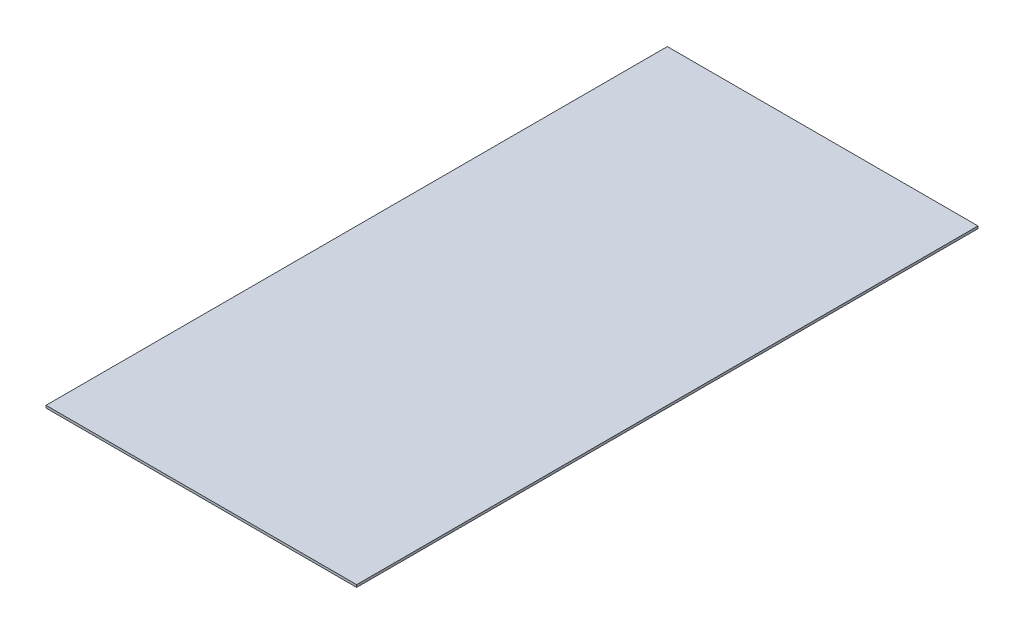
ISO-10303-21;
HEADER;
FILE_DESCRIPTION(('STEP AP214'),'2;1');
FILE_NAME('part.step','',(''),(''),'','','');
FILE_SCHEMA(('AUTOMOTIVE_DESIGN { 1 0 10303 214 1 1 1 1 }'));
ENDSEC;
DATA;
#1=APPLICATION_CONTEXT('core data for automotive mechanical design processes');
#2=APPLICATION_PROTOCOL_DEFINITION('international standard','automotive_design',2000,#1);
#3=PRODUCT_CONTEXT('',#1,'mechanical');
#4=PRODUCT('Part','Part','',(#3));
#5=PRODUCT_RELATED_PRODUCT_CATEGORY('part','',(#4));
#6=PRODUCT_DEFINITION_FORMATION('','',#4);
#7=PRODUCT_DEFINITION_CONTEXT('part definition',#1,'design');
#8=PRODUCT_DEFINITION('design','',#6,#7);
#9=PRODUCT_DEFINITION_SHAPE('','',#8);
#10=(LENGTH_UNIT() NAMED_UNIT(*) SI_UNIT(.MILLI.,.METRE.));
#11=(NAMED_UNIT(*) PLANE_ANGLE_UNIT() SI_UNIT($,.RADIAN.));
#12=(NAMED_UNIT(*) SI_UNIT($,.STERADIAN.) SOLID_ANGLE_UNIT());
#13=UNCERTAINTY_MEASURE_WITH_UNIT(LENGTH_MEASURE(1.E-05),#10,'distance_accuracy_value','');
#14=(GEOMETRIC_REPRESENTATION_CONTEXT(3) GLOBAL_UNCERTAINTY_ASSIGNED_CONTEXT((#13)) GLOBAL_UNIT_ASSIGNED_CONTEXT((#10,
#11,#12)) REPRESENTATION_CONTEXT('',''));
#15=CARTESIAN_POINT('',(0.,0.,0.));
#16=DIRECTION('',(0.,0.,1.));
#17=DIRECTION('',(1.,0.,0.));
#18=AXIS2_PLACEMENT_3D('',#15,#16,#17);
#19=CARTESIAN_POINT('',(609.6,9.5,1219.2));
#20=DIRECTION('',(-1.,0.,0.));
#21=DIRECTION('',(0.,0.,1.));
#22=AXIS2_PLACEMENT_3D('',#19,#20,#21);
#23=PLANE('',#22);
#24=DIRECTION('',(0.,0.,-1.));
#25=VECTOR('',#24,1.);
#26=CARTESIAN_POINT('',(609.6,0.,1219.2));
#27=LINE('',#26,#25);
#28=CARTESIAN_POINT('',(609.6,0.,1219.2));
#29=VERTEX_POINT('',#28);
#30=CARTESIAN_POINT('',(609.6,0.,-1219.2));
#31=VERTEX_POINT('',#30);
#32=EDGE_CURVE('E96',#29,#31,#27,.T.);
#33=ORIENTED_EDGE('',*,*,#32,.T.);
#34=DIRECTION('',(0.,-1.,0.));
#35=VECTOR('',#34,1.);
#36=CARTESIAN_POINT('',(609.6,9.5,-1219.2));
#37=LINE('',#36,#35);
#38=CARTESIAN_POINT('',(609.6,9.5,-1219.2));
#39=VERTEX_POINT('',#38);
#40=EDGE_CURVE('E11',#39,#31,#37,.T.);
#41=ORIENTED_EDGE('',*,*,#40,.F.);
#42=DIRECTION('',(0.,0.,-1.));
#43=VECTOR('',#42,1.);
#44=CARTESIAN_POINT('',(609.6,9.5,1219.2));
#45=LINE('',#44,#43);
#46=CARTESIAN_POINT('',(609.6,9.5,1219.2));
#47=VERTEX_POINT('',#46);
#48=EDGE_CURVE('E84',#47,#39,#45,.T.);
#49=ORIENTED_EDGE('',*,*,#48,.F.);
#50=DIRECTION('',(0.,-1.,0.));
#51=VECTOR('',#50,1.);
#52=CARTESIAN_POINT('',(609.6,9.5,1219.2));
#53=LINE('',#52,#51);
#54=EDGE_CURVE('E92',#47,#29,#53,.T.);
#55=ORIENTED_EDGE('',*,*,#54,.T.);
#56=EDGE_LOOP('',(#33,#41,#49,#55));
#57=FACE_BOUND('',#56,.T.);
#58=ADVANCED_FACE('F33',(#57),#23,.F.);
#59=CARTESIAN_POINT('',(-609.6,9.5,-1219.2));
#60=DIRECTION('',(0.,0.,1.));
#61=DIRECTION('',(1.,0.,0.));
#62=AXIS2_PLACEMENT_3D('',#59,#60,#61);
#63=PLANE('',#62);
#64=DIRECTION('',(-1.,0.,0.));
#65=VECTOR('',#64,1.);
#66=CARTESIAN_POINT('',(-609.6,0.,-1219.2));
#67=LINE('',#66,#65);
#68=CARTESIAN_POINT('',(-609.6,0.,-1219.2));
#69=VERTEX_POINT('',#68);
#70=EDGE_CURVE('E88',#31,#69,#67,.T.);
#71=ORIENTED_EDGE('',*,*,#70,.T.);
#72=DIRECTION('',(0.,-1.,0.));
#73=VECTOR('',#72,1.);
#74=CARTESIAN_POINT('',(-609.6,9.5,-1219.2));
#75=LINE('',#74,#73);
#76=CARTESIAN_POINT('',(-609.6,9.5,-1219.2));
#77=VERTEX_POINT('',#76);
#78=EDGE_CURVE('E41',#77,#69,#75,.T.);
#79=ORIENTED_EDGE('',*,*,#78,.F.);
#80=DIRECTION('',(-1.,0.,0.));
#81=VECTOR('',#80,1.);
#82=CARTESIAN_POINT('',(-609.6,9.5,-1219.2));
#83=LINE('',#82,#81);
#84=EDGE_CURVE('E79',#39,#77,#83,.T.);
#85=ORIENTED_EDGE('',*,*,#84,.F.);
#86=ORIENTED_EDGE('',*,*,#40,.T.);
#87=EDGE_LOOP('',(#71,#79,#85,#86));
#88=FACE_BOUND('',#87,.T.);
#89=ADVANCED_FACE('F87',(#88),#63,.F.);
#90=CARTESIAN_POINT('',(-609.6,9.5,1219.2));
#91=DIRECTION('',(1.,0.,0.));
#92=DIRECTION('',(0.,0.,-1.));
#93=AXIS2_PLACEMENT_3D('',#90,#91,#92);
#94=PLANE('',#93);
#95=DIRECTION('',(0.,0.,1.));
#96=VECTOR('',#95,1.);
#97=CARTESIAN_POINT('',(-609.6,0.,1219.2));
#98=LINE('',#97,#96);
#99=CARTESIAN_POINT('',(-609.6,0.,1219.2));
#100=VERTEX_POINT('',#99);
#101=EDGE_CURVE('E66',#69,#100,#98,.T.);
#102=ORIENTED_EDGE('',*,*,#101,.T.);
#103=DIRECTION('',(0.,-1.,0.));
#104=VECTOR('',#103,1.);
#105=CARTESIAN_POINT('',(-609.6,9.5,1219.2));
#106=LINE('',#105,#104);
#107=CARTESIAN_POINT('',(-609.6,9.5,1219.2));
#108=VERTEX_POINT('',#107);
#109=EDGE_CURVE('E89',#108,#100,#106,.T.);
#110=ORIENTED_EDGE('',*,*,#109,.F.);
#111=DIRECTION('',(0.,0.,1.));
#112=VECTOR('',#111,1.);
#113=CARTESIAN_POINT('',(-609.6,9.5,1219.2));
#114=LINE('',#113,#112);
#115=EDGE_CURVE('E82',#77,#108,#114,.T.);
#116=ORIENTED_EDGE('',*,*,#115,.F.);
#117=ORIENTED_EDGE('',*,*,#78,.T.);
#118=EDGE_LOOP('',(#102,#110,#116,#117));
#119=FACE_BOUND('',#118,.T.);
#120=ADVANCED_FACE('F90',(#119),#94,.F.);
#121=CARTESIAN_POINT('',(-609.6,9.5,1219.2));
#122=DIRECTION('',(0.,0.,-1.));
#123=DIRECTION('',(-1.,0.,0.));
#124=AXIS2_PLACEMENT_3D('',#121,#122,#123);
#125=PLANE('',#124);
#126=DIRECTION('',(1.,0.,0.));
#127=VECTOR('',#126,1.);
#128=CARTESIAN_POINT('',(-609.6,0.,1219.2));
#129=LINE('',#128,#127);
#130=EDGE_CURVE('E72',#100,#29,#129,.T.);
#131=ORIENTED_EDGE('',*,*,#130,.T.);
#132=ORIENTED_EDGE('',*,*,#54,.F.);
#133=DIRECTION('',(1.,0.,0.));
#134=VECTOR('',#133,1.);
#135=CARTESIAN_POINT('',(-609.6,9.5,1219.2));
#136=LINE('',#135,#134);
#137=EDGE_CURVE('E49',#108,#47,#136,.T.);
#138=ORIENTED_EDGE('',*,*,#137,.F.);
#139=ORIENTED_EDGE('',*,*,#109,.T.);
#140=EDGE_LOOP('',(#131,#132,#138,#139));
#141=FACE_BOUND('',#140,.T.);
#142=ADVANCED_FACE('F103',(#141),#125,.F.);
#143=CARTESIAN_POINT('',(0.,9.5,0.));
#144=DIRECTION('',(0.,-1.,0.));
#145=DIRECTION('',(0.,0.,-1.));
#146=AXIS2_PLACEMENT_3D('',#143,#144,#145);
#147=PLANE('',#146);
#148=ORIENTED_EDGE('',*,*,#48,.T.);
#149=ORIENTED_EDGE('',*,*,#84,.T.);
#150=ORIENTED_EDGE('',*,*,#115,.T.);
#151=ORIENTED_EDGE('',*,*,#137,.T.);
#152=EDGE_LOOP('',(#148,#149,#150,#151));
#153=FACE_BOUND('',#152,.T.);
#154=ADVANCED_FACE('F80',(#153),#147,.F.);
#155=CARTESIAN_POINT('',(0.,0.,0.));
#156=DIRECTION('',(0.,-1.,0.));
#157=DIRECTION('',(0.,0.,-1.));
#158=AXIS2_PLACEMENT_3D('',#155,#156,#157);
#159=PLANE('',#158);
#160=ORIENTED_EDGE('',*,*,#32,.F.);
#161=ORIENTED_EDGE('',*,*,#130,.F.);
#162=ORIENTED_EDGE('',*,*,#101,.F.);
#163=ORIENTED_EDGE('',*,*,#70,.F.);
#164=EDGE_LOOP('',(#160,#161,#162,#163));
#165=FACE_BOUND('',#164,.T.);
#166=ADVANCED_FACE('F106',(#165),#159,.T.);
#167=CLOSED_SHELL('',(#58,#89,#120,#142,#154,#166));
#168=MANIFOLD_SOLID_BREP('B2',#167);
#169=ADVANCED_BREP_SHAPE_REPRESENTATION('',(#18,#168),#14);
#170=SHAPE_DEFINITION_REPRESENTATION(#9,#169);
ENDSEC;
END-ISO-10303-21;
